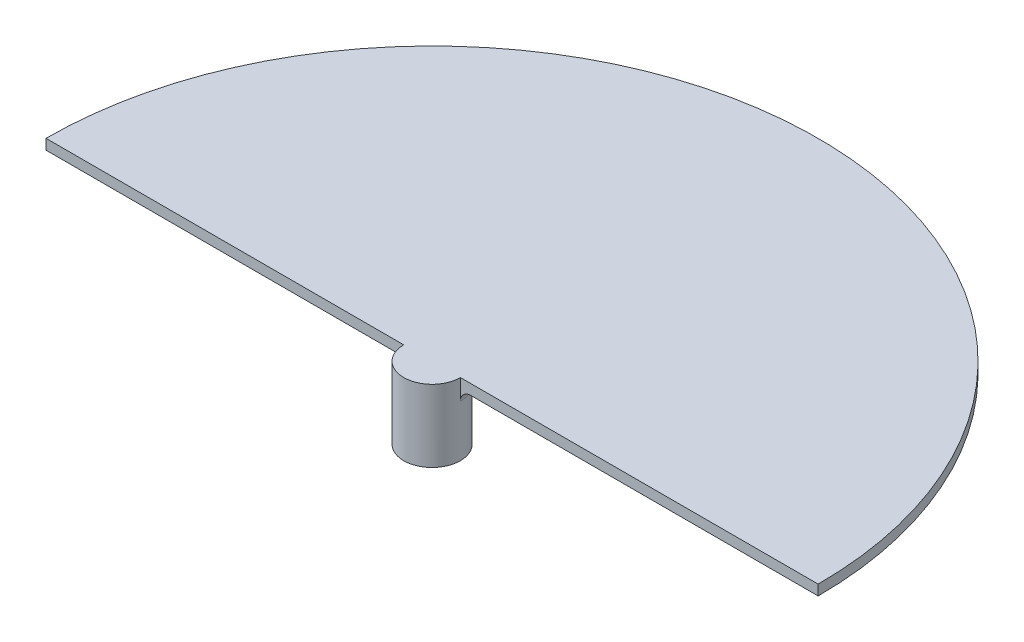
ISO-10303-21;
HEADER;
FILE_DESCRIPTION(('STEP AP214'),'2;1');
FILE_NAME('part.step','',(''),(''),'','','');
FILE_SCHEMA(('AUTOMOTIVE_DESIGN { 1 0 10303 214 1 1 1 1 }'));
ENDSEC;
DATA;
#1=APPLICATION_CONTEXT('core data for automotive mechanical design processes');
#2=APPLICATION_PROTOCOL_DEFINITION('international standard','automotive_design',2000,#1);
#3=PRODUCT_CONTEXT('',#1,'mechanical');
#4=PRODUCT('Part','Part','',(#3));
#5=PRODUCT_RELATED_PRODUCT_CATEGORY('part','',(#4));
#6=PRODUCT_DEFINITION_FORMATION('','',#4);
#7=PRODUCT_DEFINITION_CONTEXT('part definition',#1,'design');
#8=PRODUCT_DEFINITION('design','',#6,#7);
#9=PRODUCT_DEFINITION_SHAPE('','',#8);
#10=(LENGTH_UNIT() NAMED_UNIT(*) SI_UNIT(.MILLI.,.METRE.));
#11=(NAMED_UNIT(*) PLANE_ANGLE_UNIT() SI_UNIT($,.RADIAN.));
#12=(NAMED_UNIT(*) SI_UNIT($,.STERADIAN.) SOLID_ANGLE_UNIT());
#13=UNCERTAINTY_MEASURE_WITH_UNIT(LENGTH_MEASURE(1.E-05),#10,'distance_accuracy_value','');
#14=(GEOMETRIC_REPRESENTATION_CONTEXT(3) GLOBAL_UNCERTAINTY_ASSIGNED_CONTEXT((#13)) GLOBAL_UNIT_ASSIGNED_CONTEXT((#10,
#11,#12)) REPRESENTATION_CONTEXT('',''));
#15=CARTESIAN_POINT('',(0.,0.,0.));
#16=DIRECTION('',(0.,0.,1.));
#17=DIRECTION('',(1.,0.,0.));
#18=AXIS2_PLACEMENT_3D('',#15,#16,#17);
#19=CARTESIAN_POINT('',(-37.5,1.,0.));
#20=DIRECTION('',(0.,0.,-1.));
#21=DIRECTION('',(-1.,0.,0.));
#22=AXIS2_PLACEMENT_3D('',#19,#20,#21);
#23=PLANE('',#22);
#24=DIRECTION('',(1.,0.,0.));
#25=VECTOR('',#24,1.);
#26=CARTESIAN_POINT('',(-37.5,0.,0.));
#27=LINE('',#26,#25);
#28=CARTESIAN_POINT('',(-37.5,0.,0.));
#29=VERTEX_POINT('',#28);
#30=CARTESIAN_POINT('',(-3.75,0.,0.));
#31=VERTEX_POINT('',#30);
#32=EDGE_CURVE('E98',#29,#31,#27,.T.);
#33=ORIENTED_EDGE('',*,*,#32,.T.);
#34=CARTESIAN_POINT('',(-3.75,-1.,0.));
#35=DIRECTION('',(0.,0.,-1.));
#36=DIRECTION('',(-1.,0.,0.));
#37=AXIS2_PLACEMENT_3D('',#34,#35,#36);
#38=CIRCLE('',#37,1.);
#39=CARTESIAN_POINT('',(-2.75,-1.,0.));
#40=VERTEX_POINT('',#39);
#41=EDGE_CURVE('E41',#31,#40,#38,.T.);
#42=ORIENTED_EDGE('',*,*,#41,.T.);
#43=DIRECTION('',(0.,1.,0.));
#44=VECTOR('',#43,1.);
#45=CARTESIAN_POINT('',(-2.75,-6.,0.));
#46=LINE('',#45,#44);
#47=CARTESIAN_POINT('',(-2.75,1.,0.));
#48=VERTEX_POINT('',#47);
#49=EDGE_CURVE('E48',#40,#48,#46,.T.);
#50=ORIENTED_EDGE('',*,*,#49,.T.);
#51=DIRECTION('',(1.,0.,0.));
#52=VECTOR('',#51,1.);
#53=CARTESIAN_POINT('',(-37.5,1.,0.));
#54=LINE('',#53,#52);
#55=CARTESIAN_POINT('',(-37.5,1.,0.));
#56=VERTEX_POINT('',#55);
#57=EDGE_CURVE('E90',#56,#48,#54,.T.);
#58=ORIENTED_EDGE('',*,*,#57,.F.);
#59=DIRECTION('',(0.,-1.,0.));
#60=VECTOR('',#59,1.);
#61=CARTESIAN_POINT('',(-37.5,1.,0.));
#62=LINE('',#61,#60);
#63=EDGE_CURVE('E109',#56,#29,#62,.T.);
#64=ORIENTED_EDGE('',*,*,#63,.T.);
#65=EDGE_LOOP('',(#33,#42,#50,#58,#64));
#66=FACE_BOUND('',#65,.T.);
#67=ADVANCED_FACE('F33',(#66),#23,.F.);
#68=CARTESIAN_POINT('',(0.,1.,0.));
#69=DIRECTION('',(0.,-1.,0.));
#70=DIRECTION('',(0.,0.,-1.));
#71=AXIS2_PLACEMENT_3D('',#68,#69,#70);
#72=CYLINDRICAL_SURFACE('',#71,37.5);
#73=CARTESIAN_POINT('',(0.,0.,0.));
#74=DIRECTION('',(0.,1.,0.));
#75=DIRECTION('',(0.,0.,1.));
#76=AXIS2_PLACEMENT_3D('',#73,#74,#75);
#77=CIRCLE('',#76,37.5);
#78=CARTESIAN_POINT('',(37.5,0.,0.));
#79=VERTEX_POINT('',#78);
#80=EDGE_CURVE('E102',#79,#29,#77,.T.);
#81=ORIENTED_EDGE('',*,*,#80,.T.);
#82=ORIENTED_EDGE('',*,*,#63,.F.);
#83=CARTESIAN_POINT('',(0.,1.,0.));
#84=DIRECTION('',(0.,1.,0.));
#85=DIRECTION('',(0.,0.,1.));
#86=AXIS2_PLACEMENT_3D('',#83,#84,#85);
#87=CIRCLE('',#86,37.5);
#88=CARTESIAN_POINT('',(37.5,1.,0.));
#89=VERTEX_POINT('',#88);
#90=EDGE_CURVE('E96',#89,#56,#87,.T.);
#91=ORIENTED_EDGE('',*,*,#90,.F.);
#92=DIRECTION('',(0.,-1.,0.));
#93=VECTOR('',#92,1.);
#94=CARTESIAN_POINT('',(37.5,1.,0.));
#95=LINE('',#94,#93);
#96=EDGE_CURVE('E94',#89,#79,#95,.T.);
#97=ORIENTED_EDGE('',*,*,#96,.T.);
#98=EDGE_LOOP('',(#81,#82,#91,#97));
#99=FACE_BOUND('',#98,.T.);
#100=ADVANCED_FACE('F124',(#99),#72,.T.);
#101=CARTESIAN_POINT('',(2.75,1.,0.));
#102=VERTEX_POINT('',#101);
#103=EDGE_CURVE('E88',#102,#89,#54,.T.);
#104=ORIENTED_EDGE('',*,*,#103,.F.);
#105=DIRECTION('',(0.,1.,0.));
#106=VECTOR('',#105,1.);
#107=CARTESIAN_POINT('',(2.75,-6.,0.));
#108=LINE('',#107,#106);
#109=CARTESIAN_POINT('',(2.75,-1.,0.));
#110=VERTEX_POINT('',#109);
#111=EDGE_CURVE('E55',#102,#110,#108,.F.);
#112=ORIENTED_EDGE('',*,*,#111,.T.);
#113=CARTESIAN_POINT('',(3.75,-1.,0.));
#114=DIRECTION('',(0.,0.,-1.));
#115=DIRECTION('',(-1.,0.,0.));
#116=AXIS2_PLACEMENT_3D('',#113,#114,#115);
#117=CIRCLE('',#116,1.);
#118=CARTESIAN_POINT('',(3.75,0.,0.));
#119=VERTEX_POINT('',#118);
#120=EDGE_CURVE('E11',#110,#119,#117,.T.);
#121=ORIENTED_EDGE('',*,*,#120,.T.);
#122=EDGE_CURVE('E105',#119,#79,#27,.T.);
#123=ORIENTED_EDGE('',*,*,#122,.T.);
#124=ORIENTED_EDGE('',*,*,#96,.F.);
#125=EDGE_LOOP('',(#104,#112,#121,#123,#124));
#126=FACE_BOUND('',#125,.T.);
#127=ADVANCED_FACE('F92',(#126),#23,.F.);
#128=CARTESIAN_POINT('',(0.,1.,0.));
#129=DIRECTION('',(0.,1.,0.));
#130=DIRECTION('',(0.,0.,1.));
#131=AXIS2_PLACEMENT_3D('',#128,#129,#130);
#132=PLANE('',#131);
#133=ORIENTED_EDGE('',*,*,#57,.T.);
#134=CARTESIAN_POINT('',(0.,1.,0.));
#135=DIRECTION('',(0.,1.,0.));
#136=DIRECTION('',(0.,0.,1.));
#137=AXIS2_PLACEMENT_3D('',#134,#135,#136);
#138=CIRCLE('',#137,2.75);
#139=EDGE_CURVE('E78',#48,#102,#138,.T.);
#140=ORIENTED_EDGE('',*,*,#139,.T.);
#141=ORIENTED_EDGE('',*,*,#103,.T.);
#142=ORIENTED_EDGE('',*,*,#90,.T.);
#143=EDGE_LOOP('',(#133,#140,#141,#142));
#144=FACE_BOUND('',#143,.T.);
#145=ADVANCED_FACE('F86',(#144),#132,.T.);
#146=CARTESIAN_POINT('',(0.,0.,0.));
#147=DIRECTION('',(0.,1.,0.));
#148=DIRECTION('',(0.,0.,1.));
#149=AXIS2_PLACEMENT_3D('',#146,#147,#148);
#150=PLANE('',#149);
#151=ORIENTED_EDGE('',*,*,#122,.F.);
#152=CARTESIAN_POINT('',(0.,0.,0.));
#153=DIRECTION('',(0.,1.,0.));
#154=DIRECTION('',(0.,0.,1.));
#155=AXIS2_PLACEMENT_3D('',#152,#153,#154);
#156=CIRCLE('',#155,3.75);
#157=EDGE_CURVE('E112',#119,#31,#156,.T.);
#158=ORIENTED_EDGE('',*,*,#157,.T.);
#159=ORIENTED_EDGE('',*,*,#32,.F.);
#160=ORIENTED_EDGE('',*,*,#80,.F.);
#161=EDGE_LOOP('',(#151,#158,#159,#160));
#162=FACE_BOUND('',#161,.T.);
#163=ADVANCED_FACE('F121',(#162),#150,.F.);
#164=CARTESIAN_POINT('',(0.,-6.,0.));
#165=DIRECTION('',(0.,1.,0.));
#166=DIRECTION('',(0.,0.,1.));
#167=AXIS2_PLACEMENT_3D('',#164,#165,#166);
#168=CYLINDRICAL_SURFACE('',#167,2.75);
#169=CARTESIAN_POINT('',(0.,-6.,0.));
#170=DIRECTION('',(0.,1.,0.));
#171=DIRECTION('',(0.,0.,1.));
#172=AXIS2_PLACEMENT_3D('',#169,#170,#171);
#173=CIRCLE('',#172,2.75);
#174=CARTESIAN_POINT('',(0.,-6.,2.75));
#175=VERTEX_POINT('',#174);
#176=EDGE_CURVE('E82',#175,#175,#173,.T.);
#177=ORIENTED_EDGE('',*,*,#176,.T.);
#178=EDGE_LOOP('',(#177));
#179=FACE_BOUND('',#178,.T.);
#180=ORIENTED_EDGE('',*,*,#49,.F.);
#181=CARTESIAN_POINT('',(0.,-1.,0.));
#182=DIRECTION('',(0.,1.,0.));
#183=DIRECTION('',(0.,0.,1.));
#184=AXIS2_PLACEMENT_3D('',#181,#182,#183);
#185=CIRCLE('',#184,2.75);
#186=EDGE_CURVE('E80',#40,#110,#185,.F.);
#187=ORIENTED_EDGE('',*,*,#186,.T.);
#188=ORIENTED_EDGE('',*,*,#111,.F.);
#189=ORIENTED_EDGE('',*,*,#139,.F.);
#190=EDGE_LOOP('',(#180,#187,#188,#189));
#191=FACE_BOUND('',#190,.T.);
#192=ADVANCED_FACE('F77',(#179,#191),#168,.T.);
#193=CARTESIAN_POINT('',(0.,-6.,0.));
#194=DIRECTION('',(0.,1.,0.));
#195=DIRECTION('',(0.,0.,1.));
#196=AXIS2_PLACEMENT_3D('',#193,#194,#195);
#197=PLANE('',#196);
#198=ORIENTED_EDGE('',*,*,#176,.F.);
#199=EDGE_LOOP('',(#198));
#200=FACE_BOUND('',#199,.T.);
#201=ADVANCED_FACE('F138',(#200),#197,.F.);
#202=CARTESIAN_POINT('',(0.,-1.,0.));
#203=DIRECTION('',(0.,1.,0.));
#204=DIRECTION('',(0.,0.,1.));
#205=AXIS2_PLACEMENT_3D('',#202,#203,#204);
#206=TOROIDAL_SURFACE('',#205,3.75,1.);
#207=ORIENTED_EDGE('',*,*,#120,.F.);
#208=ORIENTED_EDGE('',*,*,#186,.F.);
#209=ORIENTED_EDGE('',*,*,#41,.F.);
#210=ORIENTED_EDGE('',*,*,#157,.F.);
#211=EDGE_LOOP('',(#207,#208,#209,#210));
#212=FACE_BOUND('',#211,.T.);
#213=ADVANCED_FACE('F35',(#212),#206,.F.);
#214=CLOSED_SHELL('',(#67,#100,#127,#145,#163,#192,#201,#213));
#215=MANIFOLD_SOLID_BREP('B2',#214);
#216=ADVANCED_BREP_SHAPE_REPRESENTATION('',(#18,#215),#14);
#217=SHAPE_DEFINITION_REPRESENTATION(#9,#216);
ENDSEC;
END-ISO-10303-21;
